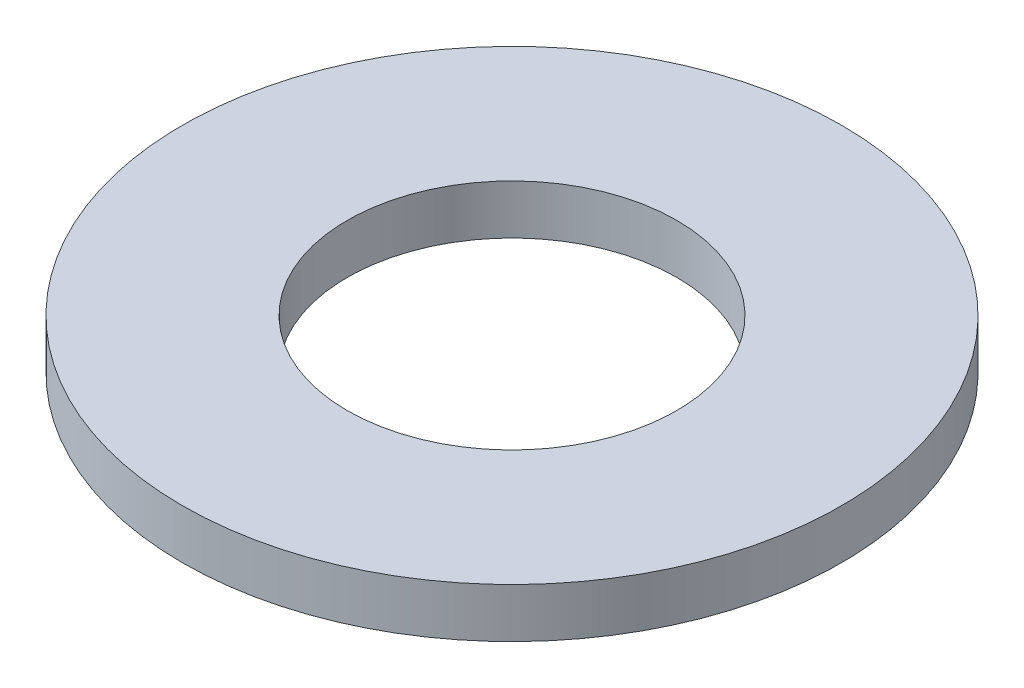
ISO-10303-21;
HEADER;
FILE_DESCRIPTION(('STEP AP214'),'2;1');
FILE_NAME('part.step','',(''),(''),'','','');
FILE_SCHEMA(('AUTOMOTIVE_DESIGN { 1 0 10303 214 1 1 1 1 }'));
ENDSEC;
DATA;
#1=APPLICATION_CONTEXT('core data for automotive mechanical design processes');
#2=APPLICATION_PROTOCOL_DEFINITION('international standard','automotive_design',2000,#1);
#3=PRODUCT_CONTEXT('',#1,'mechanical');
#4=PRODUCT('Part','Part','',(#3));
#5=PRODUCT_RELATED_PRODUCT_CATEGORY('part','',(#4));
#6=PRODUCT_DEFINITION_FORMATION('','',#4);
#7=PRODUCT_DEFINITION_CONTEXT('part definition',#1,'design');
#8=PRODUCT_DEFINITION('design','',#6,#7);
#9=PRODUCT_DEFINITION_SHAPE('','',#8);
#10=(LENGTH_UNIT() NAMED_UNIT(*) SI_UNIT(.MILLI.,.METRE.));
#11=(NAMED_UNIT(*) PLANE_ANGLE_UNIT() SI_UNIT($,.RADIAN.));
#12=(NAMED_UNIT(*) SI_UNIT($,.STERADIAN.) SOLID_ANGLE_UNIT());
#13=UNCERTAINTY_MEASURE_WITH_UNIT(LENGTH_MEASURE(1.E-05),#10,'distance_accuracy_value','');
#14=(GEOMETRIC_REPRESENTATION_CONTEXT(3) GLOBAL_UNCERTAINTY_ASSIGNED_CONTEXT((#13)) GLOBAL_UNIT_ASSIGNED_CONTEXT((#10,
#11,#12)) REPRESENTATION_CONTEXT('',''));
#15=CARTESIAN_POINT('',(0.,0.,0.));
#16=DIRECTION('',(0.,0.,1.));
#17=DIRECTION('',(1.,0.,0.));
#18=AXIS2_PLACEMENT_3D('',#15,#16,#17);
#19=CARTESIAN_POINT('',(0.,0.3,0.));
#20=DIRECTION('',(0.,1.,0.));
#21=DIRECTION('',(0.,0.,1.));
#22=AXIS2_PLACEMENT_3D('',#19,#20,#21);
#23=PLANE('',#22);
#24=CARTESIAN_POINT('',(0.,0.3,0.));
#25=DIRECTION('',(0.,1.,0.));
#26=DIRECTION('',(0.,0.,1.));
#27=AXIS2_PLACEMENT_3D('',#24,#25,#26);
#28=CIRCLE('',#27,2.);
#29=CARTESIAN_POINT('',(0.,0.3,2.));
#30=VERTEX_POINT('',#29);
#31=EDGE_CURVE('E10',#30,#30,#28,.T.);
#32=ORIENTED_EDGE('',*,*,#31,.T.);
#33=EDGE_LOOP('',(#32));
#34=FACE_BOUND('',#33,.T.);
#35=CARTESIAN_POINT('',(0.,0.3,0.));
#36=DIRECTION('',(0.,1.,0.));
#37=DIRECTION('',(0.,0.,1.));
#38=AXIS2_PLACEMENT_3D('',#35,#36,#37);
#39=CIRCLE('',#38,1.);
#40=CARTESIAN_POINT('',(0.,0.3,1.));
#41=VERTEX_POINT('',#40);
#42=EDGE_CURVE('E42',#41,#41,#39,.T.);
#43=ORIENTED_EDGE('',*,*,#42,.F.);
#44=EDGE_LOOP('',(#43));
#45=FACE_BOUND('',#44,.T.);
#46=ADVANCED_FACE('F31',(#34,#45),#23,.T.);
#47=CARTESIAN_POINT('',(0.,0.,0.));
#48=DIRECTION('',(0.,1.,0.));
#49=DIRECTION('',(0.,0.,1.));
#50=AXIS2_PLACEMENT_3D('',#47,#48,#49);
#51=PLANE('',#50);
#52=CARTESIAN_POINT('',(0.,0.,0.));
#53=DIRECTION('',(0.,1.,0.));
#54=DIRECTION('',(0.,0.,1.));
#55=AXIS2_PLACEMENT_3D('',#52,#53,#54);
#56=CIRCLE('',#55,2.);
#57=CARTESIAN_POINT('',(0.,0.,2.));
#58=VERTEX_POINT('',#57);
#59=EDGE_CURVE('E35',#58,#58,#56,.T.);
#60=ORIENTED_EDGE('',*,*,#59,.F.);
#61=EDGE_LOOP('',(#60));
#62=FACE_BOUND('',#61,.T.);
#63=CARTESIAN_POINT('',(0.,0.,0.));
#64=DIRECTION('',(0.,1.,0.));
#65=DIRECTION('',(0.,0.,1.));
#66=AXIS2_PLACEMENT_3D('',#63,#64,#65);
#67=CIRCLE('',#66,1.);
#68=CARTESIAN_POINT('',(0.,0.,1.));
#69=VERTEX_POINT('',#68);
#70=EDGE_CURVE('E44',#69,#69,#67,.T.);
#71=ORIENTED_EDGE('',*,*,#70,.T.);
#72=EDGE_LOOP('',(#71));
#73=FACE_BOUND('',#72,.T.);
#74=ADVANCED_FACE('F54',(#62,#73),#51,.F.);
#75=CARTESIAN_POINT('',(0.,0.3,0.));
#76=DIRECTION('',(0.,-1.,0.));
#77=DIRECTION('',(0.,0.,-1.));
#78=AXIS2_PLACEMENT_3D('',#75,#76,#77);
#79=CYLINDRICAL_SURFACE('',#78,2.);
#80=ORIENTED_EDGE('',*,*,#31,.F.);
#81=EDGE_LOOP('',(#80));
#82=FACE_BOUND('',#81,.T.);
#83=ORIENTED_EDGE('',*,*,#59,.T.);
#84=EDGE_LOOP('',(#83));
#85=FACE_BOUND('',#84,.T.);
#86=ADVANCED_FACE('F33',(#82,#85),#79,.T.);
#87=CARTESIAN_POINT('',(0.,0.3,0.));
#88=DIRECTION('',(0.,-1.,0.));
#89=DIRECTION('',(0.,0.,-1.));
#90=AXIS2_PLACEMENT_3D('',#87,#88,#89);
#91=CYLINDRICAL_SURFACE('',#90,1.);
#92=ORIENTED_EDGE('',*,*,#42,.T.);
#93=EDGE_LOOP('',(#92));
#94=FACE_BOUND('',#93,.T.);
#95=ORIENTED_EDGE('',*,*,#70,.F.);
#96=EDGE_LOOP('',(#95));
#97=FACE_BOUND('',#96,.T.);
#98=ADVANCED_FACE('F50',(#94,#97),#91,.F.);
#99=CLOSED_SHELL('',(#46,#74,#86,#98));
#100=MANIFOLD_SOLID_BREP('B2',#99);
#101=ADVANCED_BREP_SHAPE_REPRESENTATION('',(#18,#100),#14);
#102=SHAPE_DEFINITION_REPRESENTATION(#9,#101);
ENDSEC;
END-ISO-10303-21;
